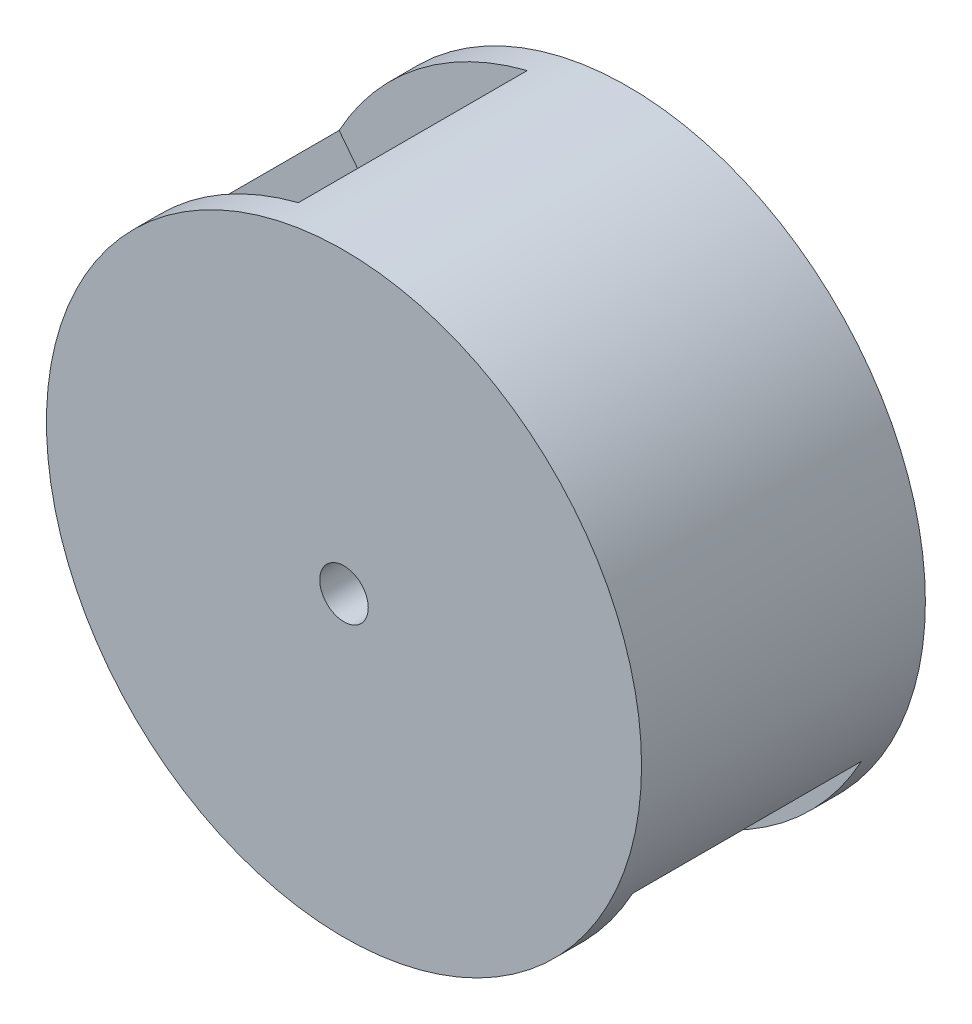
ISO-10303-21;
HEADER;
FILE_DESCRIPTION(('STEP AP214'),'2;1');
FILE_NAME('part.step','',(''),(''),'','','');
FILE_SCHEMA(('AUTOMOTIVE_DESIGN { 1 0 10303 214 1 1 1 1 }'));
ENDSEC;
DATA;
#1=APPLICATION_CONTEXT('core data for automotive mechanical design processes');
#2=APPLICATION_PROTOCOL_DEFINITION('international standard','automotive_design',2000,#1);
#3=PRODUCT_CONTEXT('',#1,'mechanical');
#4=PRODUCT('Part','Part','',(#3));
#5=PRODUCT_RELATED_PRODUCT_CATEGORY('part','',(#4));
#6=PRODUCT_DEFINITION_FORMATION('','',#4);
#7=PRODUCT_DEFINITION_CONTEXT('part definition',#1,'design');
#8=PRODUCT_DEFINITION('design','',#6,#7);
#9=PRODUCT_DEFINITION_SHAPE('','',#8);
#10=(LENGTH_UNIT() NAMED_UNIT(*) SI_UNIT(.MILLI.,.METRE.));
#11=(NAMED_UNIT(*) PLANE_ANGLE_UNIT() SI_UNIT($,.RADIAN.));
#12=(NAMED_UNIT(*) SI_UNIT($,.STERADIAN.) SOLID_ANGLE_UNIT());
#13=UNCERTAINTY_MEASURE_WITH_UNIT(LENGTH_MEASURE(1.E-05),#10,'distance_accuracy_value','');
#14=(GEOMETRIC_REPRESENTATION_CONTEXT(3) GLOBAL_UNCERTAINTY_ASSIGNED_CONTEXT((#13)) GLOBAL_UNIT_ASSIGNED_CONTEXT((#10,
#11,#12)) REPRESENTATION_CONTEXT('',''));
#15=CARTESIAN_POINT('',(0.,0.,0.));
#16=DIRECTION('',(0.,0.,1.));
#17=DIRECTION('',(1.,0.,0.));
#18=AXIS2_PLACEMENT_3D('',#15,#16,#17);
#19=CARTESIAN_POINT('',(-1.54919333848297,2.15,0.));
#20=DIRECTION('',(0.,1.,0.));
#21=DIRECTION('',(0.,0.,1.));
#22=AXIS2_PLACEMENT_3D('',#19,#20,#21);
#23=PLANE('',#22);
#24=DIRECTION('',(1.,0.,0.));
#25=VECTOR('',#24,1.);
#26=CARTESIAN_POINT('',(-1.54919333848297,2.15,28.));
#27=LINE('',#26,#25);
#28=CARTESIAN_POINT('',(-1.54919333848297,2.15,28.));
#29=VERTEX_POINT('',#28);
#30=CARTESIAN_POINT('',(1.54919333848297,2.15,28.));
#31=VERTEX_POINT('',#30);
#32=EDGE_CURVE('E11',#29,#31,#27,.T.);
#33=ORIENTED_EDGE('',*,*,#32,.F.);
#34=DIRECTION('',(0.,0.,1.));
#35=VECTOR('',#34,1.);
#36=CARTESIAN_POINT('',(-1.54919333848297,2.15,0.));
#37=LINE('',#36,#35);
#38=CARTESIAN_POINT('',(-1.54919333848297,2.15,0.));
#39=VERTEX_POINT('',#38);
#40=EDGE_CURVE('E143',#39,#29,#37,.T.);
#41=ORIENTED_EDGE('',*,*,#40,.F.);
#42=DIRECTION('',(-1.,0.,0.));
#43=VECTOR('',#42,1.);
#44=CARTESIAN_POINT('',(-1.54919333848297,2.15,0.));
#45=LINE('',#44,#43);
#46=CARTESIAN_POINT('',(1.54919333848297,2.15,0.));
#47=VERTEX_POINT('',#46);
#48=EDGE_CURVE('E147',#47,#39,#45,.T.);
#49=ORIENTED_EDGE('',*,*,#48,.F.);
#50=DIRECTION('',(0.,0.,1.));
#51=VECTOR('',#50,1.);
#52=CARTESIAN_POINT('',(1.54919333848297,2.15,0.));
#53=LINE('',#52,#51);
#54=EDGE_CURVE('E141',#47,#31,#53,.T.);
#55=ORIENTED_EDGE('',*,*,#54,.T.);
#56=EDGE_LOOP('',(#33,#41,#49,#55));
#57=FACE_BOUND('',#56,.T.);
#58=ADVANCED_FACE('F39',(#57),#23,.F.);
#59=CARTESIAN_POINT('',(0.,0.,3.));
#60=DIRECTION('',(0.,0.,1.));
#61=DIRECTION('',(1.,0.,0.));
#62=AXIS2_PLACEMENT_3D('',#59,#60,#61);
#63=PLANE('',#62);
#64=DIRECTION('',(0.612907053652977,-0.79015501237569,0.));
#65=VECTOR('',#64,1.);
#66=CARTESIAN_POINT('',(20.544030321768,-5.27481045270137,3.));
#67=LINE('',#66,#65);
#68=CARTESIAN_POINT('',(20.544030321768,-5.27481045270137,3.));
#69=VERTEX_POINT('',#68);
#70=CARTESIAN_POINT('',(28.5285194485753,-15.5683518097537,3.));
#71=VERTEX_POINT('',#70);
#72=EDGE_CURVE('E213',#69,#71,#67,.T.);
#73=ORIENTED_EDGE('',*,*,#72,.F.);
#74=DIRECTION('',(0.968583161128631,-0.248689887164856,0.));
#75=VECTOR('',#74,1.);
#76=CARTESIAN_POINT('',(7.26437370846473,-1.86517415373641,3.));
#77=LINE('',#76,#75);
#78=CARTESIAN_POINT('',(7.26437370846473,-1.86517415373641,3.));
#79=VERTEX_POINT('',#78);
#80=EDGE_CURVE('E210',#79,#69,#77,.T.);
#81=ORIENTED_EDGE('',*,*,#80,.F.);
#82=CARTESIAN_POINT('',(0.,0.,3.));
#83=DIRECTION('',(0.,0.,1.));
#84=DIRECTION('',(1.,0.,0.));
#85=AXIS2_PLACEMENT_3D('',#82,#83,#84);
#86=CIRCLE('',#85,7.5);
#87=CARTESIAN_POINT('',(0.,-7.5,3.));
#88=VERTEX_POINT('',#87);
#89=EDGE_CURVE('E207',#88,#79,#86,.T.);
#90=ORIENTED_EDGE('',*,*,#89,.F.);
#91=DIRECTION('',(0.,1.,0.));
#92=VECTOR('',#91,1.);
#93=CARTESIAN_POINT('',(0.,-7.5,3.));
#94=LINE('',#93,#92);
#95=CARTESIAN_POINT('',(0.,-21.2103938476788,3.));
#96=VERTEX_POINT('',#95);
#97=EDGE_CURVE('E204',#96,#88,#94,.T.);
#98=ORIENTED_EDGE('',*,*,#97,.F.);
#99=DIRECTION('',(-0.612907053652976,0.79015501237569,0.));
#100=VECTOR('',#99,1.);
#101=CARTESIAN_POINT('',(0.,-21.2103938476788,3.));
#102=LINE('',#101,#100);
#103=CARTESIAN_POINT('',(7.98448912680734,-31.5039352047311,3.));
#104=VERTEX_POINT('',#103);
#105=EDGE_CURVE('E201',#104,#96,#102,.T.);
#106=ORIENTED_EDGE('',*,*,#105,.F.);
#107=CARTESIAN_POINT('',(0.,0.,3.));
#108=DIRECTION('',(0.,0.,1.));
#109=DIRECTION('',(1.,0.,0.));
#110=AXIS2_PLACEMENT_3D('',#107,#108,#109);
#111=CIRCLE('',#110,32.5);
#112=EDGE_CURVE('E257',#104,#71,#111,.T.);
#113=ORIENTED_EDGE('',*,*,#112,.T.);
#114=EDGE_LOOP('',(#73,#81,#90,#98,#106,#113));
#115=FACE_BOUND('',#114,.T.);
#116=ADVANCED_FACE('F263',(#115),#63,.T.);
#117=CARTESIAN_POINT('',(0.,0.,3.));
#118=DIRECTION('',(0.,0.,-1.));
#119=DIRECTION('',(-1.,0.,0.));
#120=AXIS2_PLACEMENT_3D('',#117,#118,#119);
#121=CYLINDRICAL_SURFACE('',#120,32.5);
#122=DIRECTION('',(0.,0.,-1.));
#123=VECTOR('',#122,1.);
#124=CARTESIAN_POINT('',(7.98448912680734,-31.5039352047311,28.));
#125=LINE('',#124,#123);
#126=CARTESIAN_POINT('',(7.98448912680734,-31.5039352047311,28.));
#127=VERTEX_POINT('',#126);
#128=EDGE_CURVE('E244',#127,#104,#125,.T.);
#129=ORIENTED_EDGE('',*,*,#128,.F.);
#130=CARTESIAN_POINT('',(0.,0.,28.));
#131=DIRECTION('',(0.,0.,1.));
#132=DIRECTION('',(1.,0.,0.));
#133=AXIS2_PLACEMENT_3D('',#130,#131,#132);
#134=CIRCLE('',#133,32.5);
#135=CARTESIAN_POINT('',(28.5285194485753,-15.5683518097537,28.));
#136=VERTEX_POINT('',#135);
#137=EDGE_CURVE('E149',#127,#136,#134,.T.);
#138=ORIENTED_EDGE('',*,*,#137,.T.);
#139=DIRECTION('',(0.,0.,-1.));
#140=VECTOR('',#139,1.);
#141=CARTESIAN_POINT('',(28.5285194485753,-15.5683518097537,28.));
#142=LINE('',#141,#140);
#143=EDGE_CURVE('E229',#136,#71,#142,.T.);
#144=ORIENTED_EDGE('',*,*,#143,.T.);
#145=ORIENTED_EDGE('',*,*,#112,.F.);
#146=EDGE_LOOP('',(#129,#138,#144,#145));
#147=FACE_BOUND('',#146,.T.);
#148=CARTESIAN_POINT('',(-7.98448912680732,31.5039352047311,3.));
#149=VERTEX_POINT('',#148);
#150=CARTESIAN_POINT('',(-28.5285194485753,15.5683518097537,3.));
#151=VERTEX_POINT('',#150);
#152=EDGE_CURVE('E47',#149,#151,#111,.T.);
#153=ORIENTED_EDGE('',*,*,#152,.F.);
#154=DIRECTION('',(0.,0.,-1.));
#155=VECTOR('',#154,1.);
#156=CARTESIAN_POINT('',(-7.98448912680732,31.5039352047311,28.));
#157=LINE('',#156,#155);
#158=CARTESIAN_POINT('',(-7.98448912680732,31.5039352047311,28.));
#159=VERTEX_POINT('',#158);
#160=EDGE_CURVE('E226',#159,#149,#157,.T.);
#161=ORIENTED_EDGE('',*,*,#160,.F.);
#162=CARTESIAN_POINT('',(-28.5285194485753,15.5683518097537,28.));
#163=VERTEX_POINT('',#162);
#164=EDGE_CURVE('E158',#159,#163,#134,.T.);
#165=ORIENTED_EDGE('',*,*,#164,.T.);
#166=DIRECTION('',(0.,0.,-1.));
#167=VECTOR('',#166,1.);
#168=CARTESIAN_POINT('',(-28.5285194485753,15.5683518097537,28.));
#169=LINE('',#168,#167);
#170=EDGE_CURVE('E247',#163,#151,#169,.T.);
#171=ORIENTED_EDGE('',*,*,#170,.T.);
#172=EDGE_LOOP('',(#153,#161,#165,#171));
#173=FACE_BOUND('',#172,.T.);
#174=CARTESIAN_POINT('',(0.,0.,0.));
#175=DIRECTION('',(0.,0.,1.));
#176=DIRECTION('',(1.,0.,0.));
#177=AXIS2_PLACEMENT_3D('',#174,#175,#176);
#178=CIRCLE('',#177,32.5);
#179=CARTESIAN_POINT('',(32.5,0.,0.));
#180=VERTEX_POINT('',#179);
#181=EDGE_CURVE('E256',#180,#180,#178,.T.);
#182=ORIENTED_EDGE('',*,*,#181,.T.);
#183=EDGE_LOOP('',(#182));
#184=FACE_BOUND('',#183,.T.);
#185=CARTESIAN_POINT('',(0.,0.,31.));
#186=DIRECTION('',(0.,0.,1.));
#187=DIRECTION('',(1.,0.,0.));
#188=AXIS2_PLACEMENT_3D('',#185,#186,#187);
#189=CIRCLE('',#188,32.5);
#190=CARTESIAN_POINT('',(32.5,0.,31.));
#191=VERTEX_POINT('',#190);
#192=EDGE_CURVE('E154',#191,#191,#189,.T.);
#193=ORIENTED_EDGE('',*,*,#192,.F.);
#194=EDGE_LOOP('',(#193));
#195=FACE_BOUND('',#194,.T.);
#196=ADVANCED_FACE('F41',(#147,#173,#184,#195),#121,.T.);
#197=DIRECTION('',(0.612907053652975,-0.790155012375691,0.));
#198=VECTOR('',#197,1.);
#199=CARTESIAN_POINT('',(0.,21.2103938476788,3.));
#200=LINE('',#199,#198);
#201=CARTESIAN_POINT('',(0.,21.2103938476788,3.));
#202=VERTEX_POINT('',#201);
#203=EDGE_CURVE('E216',#149,#202,#200,.T.);
#204=ORIENTED_EDGE('',*,*,#203,.F.);
#205=ORIENTED_EDGE('',*,*,#152,.T.);
#206=DIRECTION('',(-0.612907053652977,0.79015501237569,0.));
#207=VECTOR('',#206,1.);
#208=CARTESIAN_POINT('',(-20.544030321768,5.27481045270137,3.));
#209=LINE('',#208,#207);
#210=CARTESIAN_POINT('',(-20.544030321768,5.27481045270137,3.));
#211=VERTEX_POINT('',#210);
#212=EDGE_CURVE('E198',#211,#151,#209,.T.);
#213=ORIENTED_EDGE('',*,*,#212,.F.);
#214=DIRECTION('',(-0.968583161128631,0.248689887164856,0.));
#215=VECTOR('',#214,1.);
#216=CARTESIAN_POINT('',(-20.544030321768,5.27481045270137,3.));
#217=LINE('',#216,#215);
#218=CARTESIAN_POINT('',(-7.26437370846473,1.86517415373641,3.));
#219=VERTEX_POINT('',#218);
#220=EDGE_CURVE('E195',#219,#211,#217,.T.);
#221=ORIENTED_EDGE('',*,*,#220,.F.);
#222=CARTESIAN_POINT('',(0.,0.,3.));
#223=DIRECTION('',(0.,0.,1.));
#224=DIRECTION('',(1.,0.,0.));
#225=AXIS2_PLACEMENT_3D('',#222,#223,#224);
#226=CIRCLE('',#225,7.5);
#227=CARTESIAN_POINT('',(0.,7.5,3.));
#228=VERTEX_POINT('',#227);
#229=EDGE_CURVE('E157',#228,#219,#226,.T.);
#230=ORIENTED_EDGE('',*,*,#229,.F.);
#231=DIRECTION('',(0.,-1.,0.));
#232=VECTOR('',#231,1.);
#233=CARTESIAN_POINT('',(0.,7.5,3.));
#234=LINE('',#233,#232);
#235=EDGE_CURVE('E165',#202,#228,#234,.T.);
#236=ORIENTED_EDGE('',*,*,#235,.F.);
#237=EDGE_LOOP('',(#204,#205,#213,#221,#230,#236));
#238=FACE_BOUND('',#237,.T.);
#239=ADVANCED_FACE('F302',(#238),#63,.T.);
#240=CARTESIAN_POINT('',(0.,0.,0.));
#241=DIRECTION('',(0.,0.,1.));
#242=DIRECTION('',(1.,0.,0.));
#243=AXIS2_PLACEMENT_3D('',#240,#241,#242);
#244=PLANE('',#243);
#245=ORIENTED_EDGE('',*,*,#48,.T.);
#246=CARTESIAN_POINT('',(0.,0.,0.));
#247=DIRECTION('',(0.,0.,1.));
#248=DIRECTION('',(1.,0.,0.));
#249=AXIS2_PLACEMENT_3D('',#246,#247,#248);
#250=CIRCLE('',#249,2.65);
#251=EDGE_CURVE('E60',#39,#47,#250,.T.);
#252=ORIENTED_EDGE('',*,*,#251,.T.);
#253=EDGE_LOOP('',(#245,#252));
#254=FACE_BOUND('',#253,.T.);
#255=ORIENTED_EDGE('',*,*,#181,.F.);
#256=EDGE_LOOP('',(#255));
#257=FACE_BOUND('',#256,.T.);
#258=ADVANCED_FACE('F455',(#254,#257),#244,.F.);
#259=CARTESIAN_POINT('',(0.,0.,28.));
#260=DIRECTION('',(0.,0.,-1.));
#261=DIRECTION('',(-1.,0.,0.));
#262=AXIS2_PLACEMENT_3D('',#259,#260,#261);
#263=CYLINDRICAL_SURFACE('',#262,7.5);
#264=ORIENTED_EDGE('',*,*,#229,.T.);
#265=DIRECTION('',(0.,0.,-1.));
#266=VECTOR('',#265,1.);
#267=CARTESIAN_POINT('',(-7.26437370846473,1.86517415373641,28.));
#268=LINE('',#267,#266);
#269=CARTESIAN_POINT('',(-7.26437370846473,1.86517415373641,28.));
#270=VERTEX_POINT('',#269);
#271=EDGE_CURVE('E253',#270,#219,#268,.T.);
#272=ORIENTED_EDGE('',*,*,#271,.F.);
#273=CARTESIAN_POINT('',(0.,0.,28.));
#274=DIRECTION('',(0.,0.,1.));
#275=DIRECTION('',(1.,0.,0.));
#276=AXIS2_PLACEMENT_3D('',#273,#274,#275);
#277=CIRCLE('',#276,7.5);
#278=CARTESIAN_POINT('',(0.,7.5,28.));
#279=VERTEX_POINT('',#278);
#280=EDGE_CURVE('E161',#279,#270,#277,.T.);
#281=ORIENTED_EDGE('',*,*,#280,.F.);
#282=DIRECTION('',(0.,0.,-1.));
#283=VECTOR('',#282,1.);
#284=CARTESIAN_POINT('',(0.,7.5,28.));
#285=LINE('',#284,#283);
#286=EDGE_CURVE('E192',#279,#228,#285,.T.);
#287=ORIENTED_EDGE('',*,*,#286,.T.);
#288=EDGE_LOOP('',(#264,#272,#281,#287));
#289=FACE_BOUND('',#288,.T.);
#290=ADVANCED_FACE('F445',(#289),#263,.T.);
#291=CARTESIAN_POINT('',(-20.544030321768,5.27481045270137,28.));
#292=DIRECTION('',(-0.248689887164856,-0.968583161128631,0.));
#293=DIRECTION('',(0.968583161128631,-0.248689887164856,0.));
#294=AXIS2_PLACEMENT_3D('',#291,#292,#293);
#295=PLANE('',#294);
#296=ORIENTED_EDGE('',*,*,#220,.T.);
#297=DIRECTION('',(0.,0.,-1.));
#298=VECTOR('',#297,1.);
#299=CARTESIAN_POINT('',(-20.544030321768,5.27481045270137,28.));
#300=LINE('',#299,#298);
#301=CARTESIAN_POINT('',(-20.544030321768,5.27481045270137,28.));
#302=VERTEX_POINT('',#301);
#303=EDGE_CURVE('E250',#302,#211,#300,.T.);
#304=ORIENTED_EDGE('',*,*,#303,.F.);
#305=DIRECTION('',(-0.968583161128631,0.248689887164856,0.));
#306=VECTOR('',#305,1.);
#307=CARTESIAN_POINT('',(-20.544030321768,5.27481045270137,28.));
#308=LINE('',#307,#306);
#309=EDGE_CURVE('E164',#270,#302,#308,.T.);
#310=ORIENTED_EDGE('',*,*,#309,.F.);
#311=ORIENTED_EDGE('',*,*,#271,.T.);
#312=EDGE_LOOP('',(#296,#304,#310,#311));
#313=FACE_BOUND('',#312,.T.);
#314=ADVANCED_FACE('F293',(#313),#295,.F.);
#315=CARTESIAN_POINT('',(-20.544030321768,5.27481045270137,28.));
#316=DIRECTION('',(-0.79015501237569,-0.612907053652977,0.));
#317=DIRECTION('',(0.612907053652977,-0.79015501237569,0.));
#318=AXIS2_PLACEMENT_3D('',#315,#316,#317);
#319=PLANE('',#318);
#320=ORIENTED_EDGE('',*,*,#212,.T.);
#321=ORIENTED_EDGE('',*,*,#170,.F.);
#322=DIRECTION('',(-0.612907053652977,0.79015501237569,0.));
#323=VECTOR('',#322,1.);
#324=CARTESIAN_POINT('',(-20.544030321768,5.27481045270137,28.));
#325=LINE('',#324,#323);
#326=EDGE_CURVE('E168',#302,#163,#325,.T.);
#327=ORIENTED_EDGE('',*,*,#326,.F.);
#328=ORIENTED_EDGE('',*,*,#303,.T.);
#329=EDGE_LOOP('',(#320,#321,#327,#328));
#330=FACE_BOUND('',#329,.T.);
#331=ADVANCED_FACE('F286',(#330),#319,.F.);
#332=CARTESIAN_POINT('',(0.,-21.2103938476788,28.));
#333=DIRECTION('',(-0.790155012375691,-0.612907053652976,0.));
#334=DIRECTION('',(0.612907053652976,-0.790155012375691,0.));
#335=AXIS2_PLACEMENT_3D('',#332,#333,#334);
#336=PLANE('',#335);
#337=ORIENTED_EDGE('',*,*,#105,.T.);
#338=DIRECTION('',(0.,0.,-1.));
#339=VECTOR('',#338,1.);
#340=CARTESIAN_POINT('',(0.,-21.2103938476788,28.));
#341=LINE('',#340,#339);
#342=CARTESIAN_POINT('',(0.,-21.2103938476788,28.));
#343=VERTEX_POINT('',#342);
#344=EDGE_CURVE('E241',#343,#96,#341,.T.);
#345=ORIENTED_EDGE('',*,*,#344,.F.);
#346=DIRECTION('',(-0.612907053652976,0.79015501237569,0.));
#347=VECTOR('',#346,1.);
#348=CARTESIAN_POINT('',(0.,-21.2103938476788,28.));
#349=LINE('',#348,#347);
#350=EDGE_CURVE('E171',#127,#343,#349,.T.);
#351=ORIENTED_EDGE('',*,*,#350,.F.);
#352=ORIENTED_EDGE('',*,*,#128,.T.);
#353=EDGE_LOOP('',(#337,#345,#351,#352));
#354=FACE_BOUND('',#353,.T.);
#355=ADVANCED_FACE('F284',(#354),#336,.F.);
#356=CARTESIAN_POINT('',(0.,-7.5,28.));
#357=DIRECTION('',(-1.,0.,0.));
#358=DIRECTION('',(0.,-1.,0.));
#359=AXIS2_PLACEMENT_3D('',#356,#357,#358);
#360=PLANE('',#359);
#361=ORIENTED_EDGE('',*,*,#97,.T.);
#362=DIRECTION('',(0.,0.,-1.));
#363=VECTOR('',#362,1.);
#364=CARTESIAN_POINT('',(0.,-7.5,28.));
#365=LINE('',#364,#363);
#366=CARTESIAN_POINT('',(0.,-7.5,28.));
#367=VERTEX_POINT('',#366);
#368=EDGE_CURVE('E238',#367,#88,#365,.T.);
#369=ORIENTED_EDGE('',*,*,#368,.F.);
#370=DIRECTION('',(0.,1.,0.));
#371=VECTOR('',#370,1.);
#372=CARTESIAN_POINT('',(0.,-7.5,28.));
#373=LINE('',#372,#371);
#374=EDGE_CURVE('E174',#343,#367,#373,.T.);
#375=ORIENTED_EDGE('',*,*,#374,.F.);
#376=ORIENTED_EDGE('',*,*,#344,.T.);
#377=EDGE_LOOP('',(#361,#369,#375,#376));
#378=FACE_BOUND('',#377,.T.);
#379=ADVANCED_FACE('F282',(#378),#360,.F.);
#380=CARTESIAN_POINT('',(0.,0.,28.));
#381=DIRECTION('',(0.,0.,-1.));
#382=DIRECTION('',(-1.,0.,0.));
#383=AXIS2_PLACEMENT_3D('',#380,#381,#382);
#384=CYLINDRICAL_SURFACE('',#383,7.5);
#385=ORIENTED_EDGE('',*,*,#89,.T.);
#386=DIRECTION('',(0.,0.,-1.));
#387=VECTOR('',#386,1.);
#388=CARTESIAN_POINT('',(7.26437370846473,-1.86517415373641,28.));
#389=LINE('',#388,#387);
#390=CARTESIAN_POINT('',(7.26437370846473,-1.86517415373641,28.));
#391=VERTEX_POINT('',#390);
#392=EDGE_CURVE('E235',#391,#79,#389,.T.);
#393=ORIENTED_EDGE('',*,*,#392,.F.);
#394=CARTESIAN_POINT('',(0.,0.,28.));
#395=DIRECTION('',(0.,0.,1.));
#396=DIRECTION('',(1.,0.,0.));
#397=AXIS2_PLACEMENT_3D('',#394,#395,#396);
#398=CIRCLE('',#397,7.5);
#399=EDGE_CURVE('E177',#367,#391,#398,.T.);
#400=ORIENTED_EDGE('',*,*,#399,.F.);
#401=ORIENTED_EDGE('',*,*,#368,.T.);
#402=EDGE_LOOP('',(#385,#393,#400,#401));
#403=FACE_BOUND('',#402,.T.);
#404=ADVANCED_FACE('F279',(#403),#384,.T.);
#405=CARTESIAN_POINT('',(7.26437370846473,-1.86517415373641,28.));
#406=DIRECTION('',(0.248689887164856,0.968583161128631,0.));
#407=DIRECTION('',(-0.968583161128631,0.248689887164856,0.));
#408=AXIS2_PLACEMENT_3D('',#405,#406,#407);
#409=PLANE('',#408);
#410=ORIENTED_EDGE('',*,*,#80,.T.);
#411=DIRECTION('',(0.,0.,-1.));
#412=VECTOR('',#411,1.);
#413=CARTESIAN_POINT('',(20.544030321768,-5.27481045270137,28.));
#414=LINE('',#413,#412);
#415=CARTESIAN_POINT('',(20.544030321768,-5.27481045270137,28.));
#416=VERTEX_POINT('',#415);
#417=EDGE_CURVE('E232',#416,#69,#414,.T.);
#418=ORIENTED_EDGE('',*,*,#417,.F.);
#419=DIRECTION('',(0.968583161128631,-0.248689887164856,0.));
#420=VECTOR('',#419,1.);
#421=CARTESIAN_POINT('',(7.26437370846473,-1.86517415373641,28.));
#422=LINE('',#421,#420);
#423=EDGE_CURVE('E180',#391,#416,#422,.T.);
#424=ORIENTED_EDGE('',*,*,#423,.F.);
#425=ORIENTED_EDGE('',*,*,#392,.T.);
#426=EDGE_LOOP('',(#410,#418,#424,#425));
#427=FACE_BOUND('',#426,.T.);
#428=ADVANCED_FACE('F277',(#427),#409,.F.);
#429=CARTESIAN_POINT('',(20.544030321768,-5.27481045270137,28.));
#430=DIRECTION('',(0.79015501237569,0.612907053652977,0.));
#431=DIRECTION('',(-0.612907053652977,0.79015501237569,0.));
#432=AXIS2_PLACEMENT_3D('',#429,#430,#431);
#433=PLANE('',#432);
#434=ORIENTED_EDGE('',*,*,#72,.T.);
#435=ORIENTED_EDGE('',*,*,#143,.F.);
#436=DIRECTION('',(0.612907053652977,-0.79015501237569,0.));
#437=VECTOR('',#436,1.);
#438=CARTESIAN_POINT('',(20.544030321768,-5.27481045270137,28.));
#439=LINE('',#438,#437);
#440=EDGE_CURVE('E183',#416,#136,#439,.T.);
#441=ORIENTED_EDGE('',*,*,#440,.F.);
#442=ORIENTED_EDGE('',*,*,#417,.T.);
#443=EDGE_LOOP('',(#434,#435,#441,#442));
#444=FACE_BOUND('',#443,.T.);
#445=ADVANCED_FACE('F266',(#444),#433,.F.);
#446=CARTESIAN_POINT('',(0.,21.2103938476788,28.));
#447=DIRECTION('',(0.790155012375691,0.612907053652975,0.));
#448=DIRECTION('',(-0.612907053652976,0.790155012375691,0.));
#449=AXIS2_PLACEMENT_3D('',#446,#447,#448);
#450=PLANE('',#449);
#451=ORIENTED_EDGE('',*,*,#203,.T.);
#452=DIRECTION('',(0.,0.,-1.));
#453=VECTOR('',#452,1.);
#454=CARTESIAN_POINT('',(0.,21.2103938476788,28.));
#455=LINE('',#454,#453);
#456=CARTESIAN_POINT('',(0.,21.2103938476788,28.));
#457=VERTEX_POINT('',#456);
#458=EDGE_CURVE('E223',#457,#202,#455,.T.);
#459=ORIENTED_EDGE('',*,*,#458,.F.);
#460=DIRECTION('',(0.612907053652975,-0.790155012375691,0.));
#461=VECTOR('',#460,1.);
#462=CARTESIAN_POINT('',(0.,21.2103938476788,28.));
#463=LINE('',#462,#461);
#464=EDGE_CURVE('E186',#159,#457,#463,.T.);
#465=ORIENTED_EDGE('',*,*,#464,.F.);
#466=ORIENTED_EDGE('',*,*,#160,.T.);
#467=EDGE_LOOP('',(#451,#459,#465,#466));
#468=FACE_BOUND('',#467,.T.);
#469=ADVANCED_FACE('F318',(#468),#450,.F.);
#470=CARTESIAN_POINT('',(0.,7.5,28.));
#471=DIRECTION('',(1.,0.,0.));
#472=DIRECTION('',(0.,1.,0.));
#473=AXIS2_PLACEMENT_3D('',#470,#471,#472);
#474=PLANE('',#473);
#475=ORIENTED_EDGE('',*,*,#235,.T.);
#476=ORIENTED_EDGE('',*,*,#286,.F.);
#477=DIRECTION('',(0.,-1.,0.));
#478=VECTOR('',#477,1.);
#479=CARTESIAN_POINT('',(0.,7.5,28.));
#480=LINE('',#479,#478);
#481=EDGE_CURVE('E189',#457,#279,#480,.T.);
#482=ORIENTED_EDGE('',*,*,#481,.F.);
#483=ORIENTED_EDGE('',*,*,#458,.T.);
#484=EDGE_LOOP('',(#475,#476,#482,#483));
#485=FACE_BOUND('',#484,.T.);
#486=ADVANCED_FACE('F315',(#485),#474,.F.);
#487=CARTESIAN_POINT('',(0.,0.,28.));
#488=DIRECTION('',(0.,0.,1.));
#489=DIRECTION('',(1.,0.,0.));
#490=AXIS2_PLACEMENT_3D('',#487,#488,#489);
#491=PLANE('',#490);
#492=ORIENTED_EDGE('',*,*,#137,.F.);
#493=ORIENTED_EDGE('',*,*,#350,.T.);
#494=ORIENTED_EDGE('',*,*,#374,.T.);
#495=ORIENTED_EDGE('',*,*,#399,.T.);
#496=ORIENTED_EDGE('',*,*,#423,.T.);
#497=ORIENTED_EDGE('',*,*,#440,.T.);
#498=EDGE_LOOP('',(#492,#493,#494,#495,#496,#497));
#499=FACE_BOUND('',#498,.T.);
#500=ADVANCED_FACE('F273',(#499),#491,.F.);
#501=ORIENTED_EDGE('',*,*,#309,.T.);
#502=ORIENTED_EDGE('',*,*,#326,.T.);
#503=ORIENTED_EDGE('',*,*,#164,.F.);
#504=ORIENTED_EDGE('',*,*,#464,.T.);
#505=ORIENTED_EDGE('',*,*,#481,.T.);
#506=ORIENTED_EDGE('',*,*,#280,.T.);
#507=EDGE_LOOP('',(#501,#502,#503,#504,#505,#506));
#508=FACE_BOUND('',#507,.T.);
#509=ADVANCED_FACE('F311',(#508),#491,.F.);
#510=CARTESIAN_POINT('',(0.,0.,31.));
#511=DIRECTION('',(0.,0.,1.));
#512=DIRECTION('',(1.,0.,0.));
#513=AXIS2_PLACEMENT_3D('',#510,#511,#512);
#514=PLANE('',#513);
#515=CARTESIAN_POINT('',(0.,0.,31.));
#516=DIRECTION('',(0.,0.,1.));
#517=DIRECTION('',(1.,0.,0.));
#518=AXIS2_PLACEMENT_3D('',#515,#516,#517);
#519=CIRCLE('',#518,2.65);
#520=CARTESIAN_POINT('',(2.65,0.,31.));
#521=VERTEX_POINT('',#520);
#522=EDGE_CURVE('E144',#521,#521,#519,.T.);
#523=ORIENTED_EDGE('',*,*,#522,.F.);
#524=EDGE_LOOP('',(#523));
#525=FACE_BOUND('',#524,.T.);
#526=ORIENTED_EDGE('',*,*,#192,.T.);
#527=EDGE_LOOP('',(#526));
#528=FACE_BOUND('',#527,.T.);
#529=ADVANCED_FACE('F307',(#525,#528),#514,.T.);
#530=CARTESIAN_POINT('',(0.,0.,0.));
#531=DIRECTION('',(0.,0.,1.));
#532=DIRECTION('',(1.,0.,0.));
#533=AXIS2_PLACEMENT_3D('',#530,#531,#532);
#534=CYLINDRICAL_SURFACE('',#533,2.65);
#535=ORIENTED_EDGE('',*,*,#522,.T.);
#536=EDGE_LOOP('',(#535));
#537=FACE_BOUND('',#536,.T.);
#538=CARTESIAN_POINT('',(0.,0.,28.));
#539=DIRECTION('',(0.,0.,1.));
#540=DIRECTION('',(1.,0.,0.));
#541=AXIS2_PLACEMENT_3D('',#538,#539,#540);
#542=CIRCLE('',#541,2.65);
#543=EDGE_CURVE('E52',#31,#29,#542,.T.);
#544=ORIENTED_EDGE('',*,*,#543,.F.);
#545=ORIENTED_EDGE('',*,*,#54,.F.);
#546=ORIENTED_EDGE('',*,*,#251,.F.);
#547=ORIENTED_EDGE('',*,*,#40,.T.);
#548=EDGE_LOOP('',(#544,#545,#546,#547));
#549=FACE_BOUND('',#548,.T.);
#550=ADVANCED_FACE('F140',(#537,#549),#534,.F.);
#551=CARTESIAN_POINT('',(0.,0.,28.));
#552=DIRECTION('',(0.,0.,1.));
#553=DIRECTION('',(1.,0.,0.));
#554=AXIS2_PLACEMENT_3D('',#551,#552,#553);
#555=PLANE('',#554);
#556=ORIENTED_EDGE('',*,*,#32,.T.);
#557=ORIENTED_EDGE('',*,*,#543,.T.);
#558=EDGE_LOOP('',(#556,#557));
#559=FACE_BOUND('',#558,.T.);
#560=ADVANCED_FACE('F137',(#559),#555,.T.);
#561=CLOSED_SHELL('',(#58,#116,#196,#239,#258,#290,#314,#331,#355,#379,#404,#428,#445,#469,#486,
#500,#509,#529,#550,#560));
#562=MANIFOLD_SOLID_BREP('B2',#561);
#563=ADVANCED_BREP_SHAPE_REPRESENTATION('',(#18,#562),#14);
#564=SHAPE_DEFINITION_REPRESENTATION(#9,#563);
ENDSEC;
END-ISO-10303-21;
